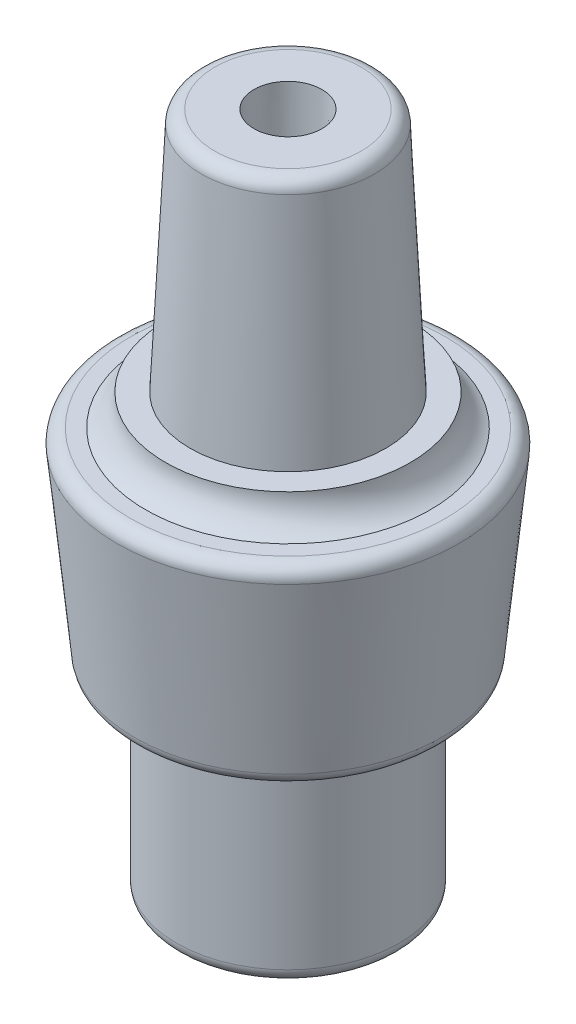
ISO-10303-21;
HEADER;
FILE_DESCRIPTION(('STEP AP214'),'2;1');
FILE_NAME('part.step','',(''),(''),'','','');
FILE_SCHEMA(('AUTOMOTIVE_DESIGN { 1 0 10303 214 1 1 1 1 }'));
ENDSEC;
DATA;
#1=APPLICATION_CONTEXT('core data for automotive mechanical design processes');
#2=APPLICATION_PROTOCOL_DEFINITION('international standard','automotive_design',2000,#1);
#3=PRODUCT_CONTEXT('',#1,'mechanical');
#4=PRODUCT('Part','Part','',(#3));
#5=PRODUCT_RELATED_PRODUCT_CATEGORY('part','',(#4));
#6=PRODUCT_DEFINITION_FORMATION('','',#4);
#7=PRODUCT_DEFINITION_CONTEXT('part definition',#1,'design');
#8=PRODUCT_DEFINITION('design','',#6,#7);
#9=PRODUCT_DEFINITION_SHAPE('','',#8);
#10=(LENGTH_UNIT() NAMED_UNIT(*) SI_UNIT(.MILLI.,.METRE.));
#11=(NAMED_UNIT(*) PLANE_ANGLE_UNIT() SI_UNIT($,.RADIAN.));
#12=(NAMED_UNIT(*) SI_UNIT($,.STERADIAN.) SOLID_ANGLE_UNIT());
#13=UNCERTAINTY_MEASURE_WITH_UNIT(LENGTH_MEASURE(1.E-05),#10,'distance_accuracy_value','');
#14=(GEOMETRIC_REPRESENTATION_CONTEXT(3) GLOBAL_UNCERTAINTY_ASSIGNED_CONTEXT((#13)) GLOBAL_UNIT_ASSIGNED_CONTEXT((#10,
#11,#12)) REPRESENTATION_CONTEXT('',''));
#15=CARTESIAN_POINT('',(0.,0.,0.));
#16=DIRECTION('',(0.,0.,1.));
#17=DIRECTION('',(1.,0.,0.));
#18=AXIS2_PLACEMENT_3D('',#15,#16,#17);
#19=CARTESIAN_POINT('',(0.,1.65,0.));
#20=DIRECTION('',(0.,1.,0.));
#21=DIRECTION('',(0.,0.,1.));
#22=AXIS2_PLACEMENT_3D('',#19,#20,#21);
#23=PLANE('',#22);
#24=CARTESIAN_POINT('',(0.,1.65,0.));
#25=DIRECTION('',(0.,-1.,0.));
#26=DIRECTION('',(0.,0.,-1.));
#27=AXIS2_PLACEMENT_3D('',#24,#25,#26);
#28=CIRCLE('',#27,1.43863068113094);
#29=CARTESIAN_POINT('',(0.,1.65,-1.43863068113094));
#30=VERTEX_POINT('',#29);
#31=EDGE_CURVE('E92',#30,#30,#28,.T.);
#32=ORIENTED_EDGE('',*,*,#31,.T.);
#33=EDGE_LOOP('',(#32));
#34=FACE_BOUND('',#33,.T.);
#35=CARTESIAN_POINT('',(0.,1.65,0.));
#36=DIRECTION('',(0.,-1.,0.));
#37=DIRECTION('',(0.,0.,-1.));
#38=AXIS2_PLACEMENT_3D('',#35,#36,#37);
#39=CIRCLE('',#38,1.8);
#40=CARTESIAN_POINT('',(0.,1.65,-1.8));
#41=VERTEX_POINT('',#40);
#42=EDGE_CURVE('E74',#41,#41,#39,.T.);
#43=ORIENTED_EDGE('',*,*,#42,.F.);
#44=EDGE_LOOP('',(#43));
#45=FACE_BOUND('',#44,.T.);
#46=ADVANCED_FACE('F42',(#34,#45),#23,.T.);
#47=CARTESIAN_POINT('',(0.,1.65,0.));
#48=DIRECTION('',(0.,-1.,0.));
#49=DIRECTION('',(0.,0.,-1.));
#50=AXIS2_PLACEMENT_3D('',#47,#48,#49);
#51=TOROIDAL_SURFACE('',#50,2.3,0.5);
#52=CARTESIAN_POINT('',(0.,1.19480825256857,0.));
#53=DIRECTION('',(0.,-1.,0.));
#54=DIRECTION('',(0.,0.,-1.));
#55=AXIS2_PLACEMENT_3D('',#52,#53,#54);
#56=CIRCLE('',#55,2.09311724801153);
#57=CARTESIAN_POINT('',(0.,1.19480825256857,-2.09311724801153));
#58=VERTEX_POINT('',#57);
#59=EDGE_CURVE('E77',#58,#58,#56,.T.);
#60=ORIENTED_EDGE('',*,*,#59,.F.);
#61=EDGE_LOOP('',(#60));
#62=FACE_BOUND('',#61,.T.);
#63=ORIENTED_EDGE('',*,*,#42,.T.);
#64=EDGE_LOOP('',(#63));
#65=FACE_BOUND('',#64,.T.);
#66=ADVANCED_FACE('F115',(#62,#65),#51,.F.);
#67=CARTESIAN_POINT('',(0.,1.19480825256857,0.));
#68=DIRECTION('',(0.,1.,0.));
#69=DIRECTION('',(0.,0.,1.));
#70=AXIS2_PLACEMENT_3D('',#67,#68,#69);
#71=PLANE('',#70);
#72=CARTESIAN_POINT('',(0.,1.19480825256857,0.));
#73=DIRECTION('',(0.,1.,0.));
#74=DIRECTION('',(0.,0.,1.));
#75=AXIS2_PLACEMENT_3D('',#72,#73,#74);
#76=CIRCLE('',#75,2.31454279166116);
#77=CARTESIAN_POINT('',(0.,1.19480825256857,2.31454279166116));
#78=VERTEX_POINT('',#77);
#79=EDGE_CURVE('E10',#78,#78,#76,.T.);
#80=ORIENTED_EDGE('',*,*,#79,.T.);
#81=EDGE_LOOP('',(#80));
#82=FACE_BOUND('',#81,.T.);
#83=ORIENTED_EDGE('',*,*,#59,.T.);
#84=EDGE_LOOP('',(#83));
#85=FACE_BOUND('',#84,.T.);
#86=ADVANCED_FACE('F120',(#82,#85),#71,.T.);
#87=CARTESIAN_POINT('',(0.,1.19480825256857,0.));
#88=DIRECTION('',(0.,1.,0.));
#89=DIRECTION('',(0.,0.,1.));
#90=AXIS2_PLACEMENT_3D('',#87,#88,#89);
#91=CONICAL_SURFACE('',#90,2.53554030408358,0.0996686524911624);
#92=CARTESIAN_POINT('',(0.,-1.62509249123563,0.));
#93=DIRECTION('',(0.,1.,0.));
#94=DIRECTION('',(0.,0.,1.));
#95=AXIS2_PLACEMENT_3D('',#92,#93,#94);
#96=CIRCLE('',#95,2.25355022970315);
#97=CARTESIAN_POINT('',(0.,-1.62509249123563,2.25355022970315));
#98=VERTEX_POINT('',#97);
#99=EDGE_CURVE('E49',#98,#98,#96,.T.);
#100=ORIENTED_EDGE('',*,*,#99,.T.);
#101=EDGE_LOOP('',(#100));
#102=FACE_BOUND('',#101,.T.);
#103=CARTESIAN_POINT('',(0.,0.974907508764372,0.));
#104=DIRECTION('',(0.,1.,0.));
#105=DIRECTION('',(0.,0.,1.));
#106=AXIS2_PLACEMENT_3D('',#103,#104,#105);
#107=CIRCLE('',#106,2.51355022970316);
#108=CARTESIAN_POINT('',(0.,0.974907508764372,2.51355022970316));
#109=VERTEX_POINT('',#108);
#110=EDGE_CURVE('E53',#109,#109,#107,.F.);
#111=ORIENTED_EDGE('',*,*,#110,.T.);
#112=EDGE_LOOP('',(#111));
#113=FACE_BOUND('',#112,.T.);
#114=ADVANCED_FACE('F141',(#102,#113),#91,.T.);
#115=CARTESIAN_POINT('',(0.,-1.80519174743143,0.));
#116=DIRECTION('',(0.,-1.,0.));
#117=DIRECTION('',(0.,0.,-1.));
#118=AXIS2_PLACEMENT_3D('',#115,#116,#117);
#119=PLANE('',#118);
#120=CARTESIAN_POINT('',(0.,-1.80519174743143,0.));
#121=DIRECTION('',(0.,-1.,0.));
#122=DIRECTION('',(0.,0.,-1.));
#123=AXIS2_PLACEMENT_3D('',#120,#121,#122);
#124=CIRCLE('',#123,2.05454279166116);
#125=CARTESIAN_POINT('',(0.,-1.80519174743143,-2.05454279166116));
#126=VERTEX_POINT('',#125);
#127=EDGE_CURVE('E57',#126,#126,#124,.T.);
#128=ORIENTED_EDGE('',*,*,#127,.T.);
#129=EDGE_LOOP('',(#128));
#130=FACE_BOUND('',#129,.T.);
#131=CARTESIAN_POINT('',(0.,-1.80519174743143,0.));
#132=DIRECTION('',(0.,-1.,0.));
#133=DIRECTION('',(0.,0.,-1.));
#134=AXIS2_PLACEMENT_3D('',#131,#132,#133);
#135=CIRCLE('',#134,1.63809523809524);
#136=CARTESIAN_POINT('',(0.,-1.80519174743143,-1.63809523809524));
#137=VERTEX_POINT('',#136);
#138=EDGE_CURVE('E80',#137,#137,#135,.T.);
#139=ORIENTED_EDGE('',*,*,#138,.F.);
#140=EDGE_LOOP('',(#139));
#141=FACE_BOUND('',#140,.T.);
#142=ADVANCED_FACE('F138',(#130,#141),#119,.T.);
#143=CARTESIAN_POINT('',(0.,-5.25,0.));
#144=DIRECTION('',(0.,-1.,0.));
#145=DIRECTION('',(0.,0.,-1.));
#146=AXIS2_PLACEMENT_3D('',#143,#144,#145);
#147=CYLINDRICAL_SURFACE('',#146,1.63809523809524);
#148=CARTESIAN_POINT('',(0.,-4.55,0.));
#149=DIRECTION('',(0.,-1.,0.));
#150=DIRECTION('',(0.,0.,-1.));
#151=AXIS2_PLACEMENT_3D('',#148,#149,#150);
#152=CIRCLE('',#151,1.63809523809524);
#153=CARTESIAN_POINT('',(0.,-4.55,-1.63809523809524));
#154=VERTEX_POINT('',#153);
#155=EDGE_CURVE('E62',#154,#154,#152,.F.);
#156=ORIENTED_EDGE('',*,*,#155,.T.);
#157=EDGE_LOOP('',(#156));
#158=FACE_BOUND('',#157,.T.);
#159=ORIENTED_EDGE('',*,*,#138,.T.);
#160=EDGE_LOOP('',(#159));
#161=FACE_BOUND('',#160,.T.);
#162=ADVANCED_FACE('F140',(#158,#161),#147,.T.);
#163=CARTESIAN_POINT('',(0.,-4.75,0.));
#164=DIRECTION('',(0.,-1.,0.));
#165=DIRECTION('',(0.,0.,-1.));
#166=AXIS2_PLACEMENT_3D('',#163,#164,#165);
#167=PLANE('',#166);
#168=CARTESIAN_POINT('',(0.,-4.75,0.));
#169=DIRECTION('',(0.,-1.,0.));
#170=DIRECTION('',(0.,0.,-1.));
#171=AXIS2_PLACEMENT_3D('',#168,#169,#170);
#172=CIRCLE('',#171,1.43809523809524);
#173=CARTESIAN_POINT('',(0.,-4.75,-1.43809523809524));
#174=VERTEX_POINT('',#173);
#175=EDGE_CURVE('E65',#174,#174,#172,.T.);
#176=ORIENTED_EDGE('',*,*,#175,.T.);
#177=EDGE_LOOP('',(#176));
#178=FACE_BOUND('',#177,.T.);
#179=CARTESIAN_POINT('',(0.,-4.75,0.));
#180=DIRECTION('',(0.,-1.,0.));
#181=DIRECTION('',(0.,0.,-1.));
#182=AXIS2_PLACEMENT_3D('',#179,#180,#181);
#183=CIRCLE('',#182,0.4);
#184=CARTESIAN_POINT('',(0.,-4.75,-0.4));
#185=VERTEX_POINT('',#184);
#186=EDGE_CURVE('E83',#185,#185,#183,.T.);
#187=ORIENTED_EDGE('',*,*,#186,.F.);
#188=EDGE_LOOP('',(#187));
#189=FACE_BOUND('',#188,.T.);
#190=ADVANCED_FACE('F146',(#178,#189),#167,.T.);
#191=CARTESIAN_POINT('',(0.,-5.25,0.));
#192=DIRECTION('',(0.,-1.,0.));
#193=DIRECTION('',(0.,0.,-1.));
#194=AXIS2_PLACEMENT_3D('',#191,#192,#193);
#195=CYLINDRICAL_SURFACE('',#194,0.4);
#196=ORIENTED_EDGE('',*,*,#186,.T.);
#197=EDGE_LOOP('',(#196));
#198=FACE_BOUND('',#197,.T.);
#199=CARTESIAN_POINT('',(0.,1.65,0.));
#200=DIRECTION('',(0.,-1.,0.));
#201=DIRECTION('',(0.,0.,-1.));
#202=AXIS2_PLACEMENT_3D('',#199,#200,#201);
#203=CIRCLE('',#202,0.4);
#204=CARTESIAN_POINT('',(0.,1.65,-0.4));
#205=VERTEX_POINT('',#204);
#206=EDGE_CURVE('E86',#205,#205,#203,.T.);
#207=ORIENTED_EDGE('',*,*,#206,.F.);
#208=EDGE_LOOP('',(#207));
#209=FACE_BOUND('',#208,.T.);
#210=ADVANCED_FACE('F152',(#198,#209),#195,.F.);
#211=CARTESIAN_POINT('',(0.,5.25,0.));
#212=DIRECTION('',(0.,1.,0.));
#213=DIRECTION('',(0.,0.,1.));
#214=AXIS2_PLACEMENT_3D('',#211,#212,#213);
#215=CONICAL_SURFACE('',#214,0.5,0.0277706365934211);
#216=ORIENTED_EDGE('',*,*,#206,.T.);
#217=EDGE_LOOP('',(#216));
#218=FACE_BOUND('',#217,.T.);
#219=CARTESIAN_POINT('',(0.,5.25,0.));
#220=DIRECTION('',(0.,-1.,0.));
#221=DIRECTION('',(0.,0.,-1.));
#222=AXIS2_PLACEMENT_3D('',#219,#220,#221);
#223=CIRCLE('',#222,0.5);
#224=CARTESIAN_POINT('',(0.,5.25,-0.5));
#225=VERTEX_POINT('',#224);
#226=EDGE_CURVE('E89',#225,#225,#223,.T.);
#227=ORIENTED_EDGE('',*,*,#226,.F.);
#228=EDGE_LOOP('',(#227));
#229=FACE_BOUND('',#228,.T.);
#230=ADVANCED_FACE('F111',(#218,#229),#215,.F.);
#231=CARTESIAN_POINT('',(0.,5.25,0.));
#232=DIRECTION('',(0.,-1.,0.));
#233=DIRECTION('',(0.,0.,-1.));
#234=AXIS2_PLACEMENT_3D('',#231,#232,#233);
#235=PLANE('',#234);
#236=CARTESIAN_POINT('',(0.,5.25,0.));
#237=DIRECTION('',(0.,-1.,0.));
#238=DIRECTION('',(0.,0.,-1.));
#239=AXIS2_PLACEMENT_3D('',#236,#237,#238);
#240=CIRCLE('',#239,1.07363000751203);
#241=CARTESIAN_POINT('',(0.,5.25,-1.07363000751203));
#242=VERTEX_POINT('',#241);
#243=EDGE_CURVE('E68',#242,#242,#240,.F.);
#244=ORIENTED_EDGE('',*,*,#243,.T.);
#245=EDGE_LOOP('',(#244));
#246=FACE_BOUND('',#245,.T.);
#247=ORIENTED_EDGE('',*,*,#226,.T.);
#248=EDGE_LOOP('',(#247));
#249=FACE_BOUND('',#248,.T.);
#250=ADVANCED_FACE('F101',(#246,#249),#235,.F.);
#251=CARTESIAN_POINT('',(0.,5.25,0.));
#252=DIRECTION('',(0.,-1.,0.));
#253=DIRECTION('',(0.,0.,-1.));
#254=AXIS2_PLACEMENT_3D('',#251,#252,#253);
#255=CONICAL_SURFACE('',#254,1.26417259676962,0.048422696963922);
#256=CARTESIAN_POINT('',(0.,5.05968075518693,0.));
#257=DIRECTION('',(0.,1.,0.));
#258=DIRECTION('',(0.,0.,1.));
#259=AXIS2_PLACEMENT_3D('',#256,#257,#258);
#260=CIRCLE('',#259,1.27339557756606);
#261=CARTESIAN_POINT('',(0.,5.05968075518693,1.27339557756606));
#262=VERTEX_POINT('',#261);
#263=EDGE_CURVE('E71',#262,#262,#260,.F.);
#264=ORIENTED_EDGE('',*,*,#263,.T.);
#265=EDGE_LOOP('',(#264));
#266=FACE_BOUND('',#265,.T.);
#267=ORIENTED_EDGE('',*,*,#31,.F.);
#268=EDGE_LOOP('',(#267));
#269=FACE_BOUND('',#268,.T.);
#270=ADVANCED_FACE('F98',(#266,#269),#255,.T.);
#271=CARTESIAN_POINT('',(0.,5.05,0.));
#272=DIRECTION('',(0.,-1.,0.));
#273=DIRECTION('',(0.,0.,-1.));
#274=AXIS2_PLACEMENT_3D('',#271,#272,#273);
#275=TOROIDAL_SURFACE('',#274,1.07363000751203,0.2);
#276=ORIENTED_EDGE('',*,*,#243,.F.);
#277=EDGE_LOOP('',(#276));
#278=FACE_BOUND('',#277,.T.);
#279=ORIENTED_EDGE('',*,*,#263,.F.);
#280=EDGE_LOOP('',(#279));
#281=FACE_BOUND('',#280,.T.);
#282=ADVANCED_FACE('F100',(#278,#281),#275,.T.);
#283=CARTESIAN_POINT('',(0.,-4.55,0.));
#284=DIRECTION('',(0.,-1.,0.));
#285=DIRECTION('',(0.,0.,-1.));
#286=AXIS2_PLACEMENT_3D('',#283,#284,#285);
#287=TOROIDAL_SURFACE('',#286,1.43809523809524,0.2);
#288=ORIENTED_EDGE('',*,*,#155,.F.);
#289=EDGE_LOOP('',(#288));
#290=FACE_BOUND('',#289,.T.);
#291=ORIENTED_EDGE('',*,*,#175,.F.);
#292=EDGE_LOOP('',(#291));
#293=FACE_BOUND('',#292,.T.);
#294=ADVANCED_FACE('F108',(#290,#293),#287,.T.);
#295=CARTESIAN_POINT('',(0.,-1.60519174743143,0.));
#296=DIRECTION('',(0.,-1.,0.));
#297=DIRECTION('',(0.,0.,-1.));
#298=AXIS2_PLACEMENT_3D('',#295,#296,#297);
#299=TOROIDAL_SURFACE('',#298,2.05454279166116,0.2);
#300=ORIENTED_EDGE('',*,*,#99,.F.);
#301=EDGE_LOOP('',(#300));
#302=FACE_BOUND('',#301,.T.);
#303=ORIENTED_EDGE('',*,*,#127,.F.);
#304=EDGE_LOOP('',(#303));
#305=FACE_BOUND('',#304,.T.);
#306=ADVANCED_FACE('F126',(#302,#305),#299,.T.);
#307=CARTESIAN_POINT('',(0.,0.994808252568572,0.));
#308=DIRECTION('',(0.,1.,0.));
#309=DIRECTION('',(0.,0.,1.));
#310=AXIS2_PLACEMENT_3D('',#307,#308,#309);
#311=TOROIDAL_SURFACE('',#310,2.31454279166116,0.2);
#312=ORIENTED_EDGE('',*,*,#79,.F.);
#313=EDGE_LOOP('',(#312));
#314=FACE_BOUND('',#313,.T.);
#315=ORIENTED_EDGE('',*,*,#110,.F.);
#316=EDGE_LOOP('',(#315));
#317=FACE_BOUND('',#316,.T.);
#318=ADVANCED_FACE('F44',(#314,#317),#311,.T.);
#319=CLOSED_SHELL('',(#46,#66,#86,#114,#142,#162,#190,#210,#230,#250,#270,#282,#294,#306,#318));
#320=MANIFOLD_SOLID_BREP('B2',#319);
#321=ADVANCED_BREP_SHAPE_REPRESENTATION('',(#18,#320),#14);
#322=SHAPE_DEFINITION_REPRESENTATION(#9,#321);
ENDSEC;
END-ISO-10303-21;
